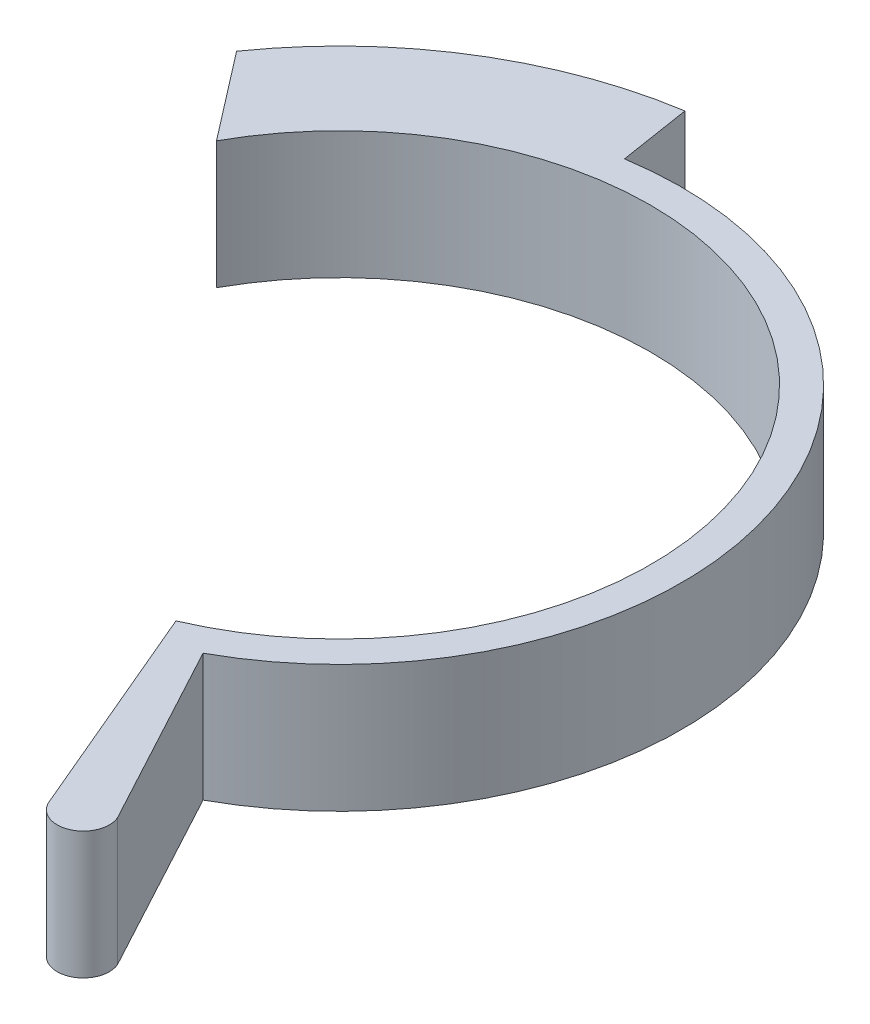
ISO-10303-21;
HEADER;
FILE_DESCRIPTION(('STEP AP214'),'2;1');
FILE_NAME('part.step','',(''),(''),'','','');
FILE_SCHEMA(('AUTOMOTIVE_DESIGN { 1 0 10303 214 1 1 1 1 }'));
ENDSEC;
DATA;
#1=APPLICATION_CONTEXT('core data for automotive mechanical design processes');
#2=APPLICATION_PROTOCOL_DEFINITION('international standard','automotive_design',2000,#1);
#3=PRODUCT_CONTEXT('',#1,'mechanical');
#4=PRODUCT('Part','Part','',(#3));
#5=PRODUCT_RELATED_PRODUCT_CATEGORY('part','',(#4));
#6=PRODUCT_DEFINITION_FORMATION('','',#4);
#7=PRODUCT_DEFINITION_CONTEXT('part definition',#1,'design');
#8=PRODUCT_DEFINITION('design','',#6,#7);
#9=PRODUCT_DEFINITION_SHAPE('','',#8);
#10=(LENGTH_UNIT() NAMED_UNIT(*) SI_UNIT(.MILLI.,.METRE.));
#11=(NAMED_UNIT(*) PLANE_ANGLE_UNIT() SI_UNIT($,.RADIAN.));
#12=(NAMED_UNIT(*) SI_UNIT($,.STERADIAN.) SOLID_ANGLE_UNIT());
#13=UNCERTAINTY_MEASURE_WITH_UNIT(LENGTH_MEASURE(1.E-05),#10,'distance_accuracy_value','');
#14=(GEOMETRIC_REPRESENTATION_CONTEXT(3) GLOBAL_UNCERTAINTY_ASSIGNED_CONTEXT((#13)) GLOBAL_UNIT_ASSIGNED_CONTEXT((#10,
#11,#12)) REPRESENTATION_CONTEXT('',''));
#15=CARTESIAN_POINT('',(0.,0.,0.));
#16=DIRECTION('',(0.,0.,1.));
#17=DIRECTION('',(1.,0.,0.));
#18=AXIS2_PLACEMENT_3D('',#15,#16,#17);
#19=CARTESIAN_POINT('',(0.121103357338385,12.26,-0.0513055872205986));
#20=DIRECTION('',(0.920777378559709,0.,-0.39008847603167));
#21=DIRECTION('',(-0.39008847603167,0.,-0.920777378559709));
#22=AXIS2_PLACEMENT_3D('',#19,#20,#21);
#23=PLANE('',#22);
#24=DIRECTION('',(0.39008847603167,0.,0.920777378559709));
#25=VECTOR('',#24,1.);
#26=CARTESIAN_POINT('',(0.121103357338385,0.,-0.0513055872205986));
#27=LINE('',#26,#25);
#28=CARTESIAN_POINT('',(11.8236451733782,0.,27.5717503037811));
#29=VERTEX_POINT('',#28);
#30=CARTESIAN_POINT('',(20.7956903462746,0.,48.7496541441093));
#31=VERTEX_POINT('',#30);
#32=EDGE_CURVE('E133',#29,#31,#27,.T.);
#33=ORIENTED_EDGE('',*,*,#32,.T.);
#34=DIRECTION('',(0.,-1.,0.));
#35=VECTOR('',#34,1.);
#36=CARTESIAN_POINT('',(20.7956903462746,12.26,48.7496541441093));
#37=LINE('',#36,#35);
#38=CARTESIAN_POINT('',(20.7956903462746,12.26,48.7496541441093));
#39=VERTEX_POINT('',#38);
#40=EDGE_CURVE('E11',#39,#31,#37,.T.);
#41=ORIENTED_EDGE('',*,*,#40,.F.);
#42=DIRECTION('',(0.39008847603167,0.,0.920777378559709));
#43=VECTOR('',#42,1.);
#44=CARTESIAN_POINT('',(0.121103357338385,12.26,-0.0513055872205986));
#45=LINE('',#44,#43);
#46=CARTESIAN_POINT('',(11.8236451733782,12.26,27.5717503037811));
#47=VERTEX_POINT('',#46);
#48=EDGE_CURVE('E151',#47,#39,#45,.T.);
#49=ORIENTED_EDGE('',*,*,#48,.F.);
#50=DIRECTION('',(0.,-1.,0.));
#51=VECTOR('',#50,1.);
#52=CARTESIAN_POINT('',(11.8236451733782,12.26,27.5717503037811));
#53=LINE('',#52,#51);
#54=EDGE_CURVE('E53',#47,#29,#53,.T.);
#55=ORIENTED_EDGE('',*,*,#54,.T.);
#56=EDGE_LOOP('',(#33,#41,#49,#55));
#57=FACE_BOUND('',#56,.T.);
#58=ADVANCED_FACE('F37',(#57),#23,.F.);
#59=CARTESIAN_POINT('',(23.1246397537649,12.26,47.8018296540694));
#60=DIRECTION('',(0.,-1.,0.));
#61=DIRECTION('',(0.,0.,-1.));
#62=AXIS2_PLACEMENT_3D('',#59,#60,#61);
#63=CYLINDRICAL_SURFACE('',#62,2.51443365523314);
#64=CARTESIAN_POINT('',(23.1246397537649,0.,47.8018296540694));
#65=DIRECTION('',(0.,1.,0.));
#66=DIRECTION('',(0.,0.,1.));
#67=AXIS2_PLACEMENT_3D('',#64,#65,#66);
#68=CIRCLE('',#67,2.51443365523314);
#69=CARTESIAN_POINT('',(25.4535891612553,0.,46.8540051640295));
#70=VERTEX_POINT('',#69);
#71=EDGE_CURVE('E135',#31,#70,#68,.T.);
#72=ORIENTED_EDGE('',*,*,#71,.T.);
#73=DIRECTION('',(0.,-1.,0.));
#74=VECTOR('',#73,1.);
#75=CARTESIAN_POINT('',(25.4535891612553,12.26,46.8540051640295));
#76=LINE('',#75,#74);
#77=CARTESIAN_POINT('',(25.4535891612553,12.26,46.8540051640295));
#78=VERTEX_POINT('',#77);
#79=EDGE_CURVE('E45',#78,#70,#76,.T.);
#80=ORIENTED_EDGE('',*,*,#79,.F.);
#81=CARTESIAN_POINT('',(23.1246397537649,12.26,47.8018296540694));
#82=DIRECTION('',(0.,1.,0.));
#83=DIRECTION('',(0.,0.,1.));
#84=AXIS2_PLACEMENT_3D('',#81,#82,#83);
#85=CIRCLE('',#84,2.51443365523314);
#86=EDGE_CURVE('E91',#39,#78,#85,.T.);
#87=ORIENTED_EDGE('',*,*,#86,.F.);
#88=ORIENTED_EDGE('',*,*,#40,.T.);
#89=EDGE_LOOP('',(#72,#80,#87,#88));
#90=FACE_BOUND('',#89,.T.);
#91=ADVANCED_FACE('F180',(#90),#63,.T.);
#92=CARTESIAN_POINT('',(0.185214082331555,12.26,-0.0996739550564852));
#93=DIRECTION('',(-0.880583613390415,0.,0.473890810027246));
#94=DIRECTION('',(0.473890810027246,0.,0.880583613390416));
#95=AXIS2_PLACEMENT_3D('',#92,#93,#94);
#96=PLANE('',#95);
#97=DIRECTION('',(-0.473890810027246,0.,-0.880583613390416));
#98=VECTOR('',#97,1.);
#99=CARTESIAN_POINT('',(0.185214082331555,0.,-0.0996739550564852));
#100=LINE('',#99,#98);
#101=CARTESIAN_POINT('',(15.8232931656359,0.,28.9589950342608));
#102=VERTEX_POINT('',#101);
#103=EDGE_CURVE('E137',#70,#102,#100,.T.);
#104=ORIENTED_EDGE('',*,*,#103,.T.);
#105=DIRECTION('',(0.,-1.,0.));
#106=VECTOR('',#105,1.);
#107=CARTESIAN_POINT('',(15.8232931656359,12.26,28.9589950342608));
#108=LINE('',#107,#106);
#109=CARTESIAN_POINT('',(15.8232931656359,12.26,28.9589950342608));
#110=VERTEX_POINT('',#109);
#111=EDGE_CURVE('E157',#110,#102,#108,.T.);
#112=ORIENTED_EDGE('',*,*,#111,.F.);
#113=DIRECTION('',(-0.473890810027246,0.,-0.880583613390416));
#114=VECTOR('',#113,1.);
#115=CARTESIAN_POINT('',(0.185214082331555,12.26,-0.0996739550564852));
#116=LINE('',#115,#114);
#117=EDGE_CURVE('E165',#78,#110,#116,.T.);
#118=ORIENTED_EDGE('',*,*,#117,.F.);
#119=ORIENTED_EDGE('',*,*,#79,.T.);
#120=EDGE_LOOP('',(#104,#112,#118,#119));
#121=FACE_BOUND('',#120,.T.);
#122=ADVANCED_FACE('F163',(#121),#96,.F.);
#123=CARTESIAN_POINT('',(0.,12.26,0.));
#124=DIRECTION('',(0.,-1.,0.));
#125=DIRECTION('',(0.,0.,-1.));
#126=AXIS2_PLACEMENT_3D('',#123,#124,#125);
#127=CYLINDRICAL_SURFACE('',#126,33.);
#128=CARTESIAN_POINT('',(0.,0.,0.));
#129=DIRECTION('',(0.,1.,0.));
#130=DIRECTION('',(0.,0.,1.));
#131=AXIS2_PLACEMENT_3D('',#128,#129,#130);
#132=CIRCLE('',#131,33.);
#133=CARTESIAN_POINT('',(-5.12453422436956,0.,-32.5996801975612));
#134=VERTEX_POINT('',#133);
#135=EDGE_CURVE('E139',#102,#134,#132,.T.);
#136=ORIENTED_EDGE('',*,*,#135,.T.);
#137=DIRECTION('',(0.,-1.,0.));
#138=VECTOR('',#137,1.);
#139=CARTESIAN_POINT('',(-5.12453422436956,12.26,-32.5996801975612));
#140=LINE('',#139,#138);
#141=CARTESIAN_POINT('',(-5.12453422436956,12.26,-32.5996801975612));
#142=VERTEX_POINT('',#141);
#143=EDGE_CURVE('E155',#142,#134,#140,.T.);
#144=ORIENTED_EDGE('',*,*,#143,.F.);
#145=CARTESIAN_POINT('',(0.,12.26,0.));
#146=DIRECTION('',(0.,1.,0.));
#147=DIRECTION('',(0.,0.,1.));
#148=AXIS2_PLACEMENT_3D('',#145,#146,#147);
#149=CIRCLE('',#148,33.);
#150=EDGE_CURVE('E174',#110,#142,#149,.T.);
#151=ORIENTED_EDGE('',*,*,#150,.F.);
#152=ORIENTED_EDGE('',*,*,#111,.T.);
#153=EDGE_LOOP('',(#136,#144,#151,#152));
#154=FACE_BOUND('',#153,.T.);
#155=ADVANCED_FACE('F172',(#154),#127,.T.);
#156=CARTESIAN_POINT('',(0.,12.26,0.));
#157=DIRECTION('',(0.987869096895794,0.,-0.155288915889987));
#158=DIRECTION('',(-0.155288915889987,0.,-0.987869096895794));
#159=AXIS2_PLACEMENT_3D('',#156,#157,#158);
#160=PLANE('',#159);
#161=DIRECTION('',(0.155288915889987,0.,0.987869096895794));
#162=VECTOR('',#161,1.);
#163=CARTESIAN_POINT('',(0.,0.,0.));
#164=LINE('',#163,#162);
#165=CARTESIAN_POINT('',(-6.21155663559947,0.,-39.5147638758318));
#166=VERTEX_POINT('',#165);
#167=EDGE_CURVE('E142',#166,#134,#164,.T.);
#168=ORIENTED_EDGE('',*,*,#167,.F.);
#169=DIRECTION('',(0.,-1.,0.));
#170=VECTOR('',#169,1.);
#171=CARTESIAN_POINT('',(-6.21155663559947,12.26,-39.5147638758318));
#172=LINE('',#171,#170);
#173=CARTESIAN_POINT('',(-6.21155663559947,12.26,-39.5147638758318));
#174=VERTEX_POINT('',#173);
#175=EDGE_CURVE('E125',#174,#166,#172,.T.);
#176=ORIENTED_EDGE('',*,*,#175,.F.);
#177=DIRECTION('',(0.155288915889987,0.,0.987869096895794));
#178=VECTOR('',#177,1.);
#179=CARTESIAN_POINT('',(0.,12.26,0.));
#180=LINE('',#179,#178);
#181=EDGE_CURVE('E115',#174,#142,#180,.T.);
#182=ORIENTED_EDGE('',*,*,#181,.T.);
#183=ORIENTED_EDGE('',*,*,#143,.T.);
#184=EDGE_LOOP('',(#168,#176,#182,#183));
#185=FACE_BOUND('',#184,.T.);
#186=ADVANCED_FACE('F190',(#185),#160,.T.);
#187=CARTESIAN_POINT('',(0.,12.26,0.));
#188=DIRECTION('',(0.,-1.,0.));
#189=DIRECTION('',(0.,0.,-1.));
#190=AXIS2_PLACEMENT_3D('',#187,#188,#189);
#191=CYLINDRICAL_SURFACE('',#190,40.);
#192=CARTESIAN_POINT('',(0.,0.,0.));
#193=DIRECTION('',(0.,1.,0.));
#194=DIRECTION('',(0.,0.,1.));
#195=AXIS2_PLACEMENT_3D('',#192,#193,#194);
#196=CIRCLE('',#195,40.);
#197=CARTESIAN_POINT('',(-32.8000736984818,0.,-22.8944352490766));
#198=VERTEX_POINT('',#197);
#199=EDGE_CURVE('E122',#166,#198,#196,.T.);
#200=ORIENTED_EDGE('',*,*,#199,.T.);
#201=DIRECTION('',(0.,-1.,0.));
#202=VECTOR('',#201,1.);
#203=CARTESIAN_POINT('',(-32.8000736984818,12.26,-22.8944352490766));
#204=LINE('',#203,#202);
#205=CARTESIAN_POINT('',(-32.8000736984818,12.26,-22.8944352490766));
#206=VERTEX_POINT('',#205);
#207=EDGE_CURVE('E119',#206,#198,#204,.T.);
#208=ORIENTED_EDGE('',*,*,#207,.F.);
#209=CARTESIAN_POINT('',(0.,12.26,0.));
#210=DIRECTION('',(0.,1.,0.));
#211=DIRECTION('',(0.,0.,1.));
#212=AXIS2_PLACEMENT_3D('',#209,#210,#211);
#213=CIRCLE('',#212,40.);
#214=EDGE_CURVE('E108',#174,#206,#213,.T.);
#215=ORIENTED_EDGE('',*,*,#214,.F.);
#216=ORIENTED_EDGE('',*,*,#175,.T.);
#217=EDGE_LOOP('',(#200,#208,#215,#216));
#218=FACE_BOUND('',#217,.T.);
#219=ADVANCED_FACE('F120',(#218),#191,.T.);
#220=CARTESIAN_POINT('',(-9.50397641638218,12.26,7.3262836606871));
#221=DIRECTION('',(-0.791998034698516,0.,0.610523638390593));
#222=DIRECTION('',(0.610523638390593,0.,0.791998034698516));
#223=AXIS2_PLACEMENT_3D('',#220,#221,#222);
#224=PLANE('',#223);
#225=DIRECTION('',(-0.610523638390593,0.,-0.791998034698517));
#226=VECTOR('',#225,1.);
#227=CARTESIAN_POINT('',(-9.50397641638218,0.,7.3262836606871));
#228=LINE('',#227,#226);
#229=CARTESIAN_POINT('',(-26.2906011352906,0.,-14.4500620048862));
#230=VERTEX_POINT('',#229);
#231=EDGE_CURVE('E146',#230,#198,#228,.T.);
#232=ORIENTED_EDGE('',*,*,#231,.F.);
#233=DIRECTION('',(0.,-1.,0.));
#234=VECTOR('',#233,1.);
#235=CARTESIAN_POINT('',(-26.2906011352906,12.26,-14.4500620048862));
#236=LINE('',#235,#234);
#237=CARTESIAN_POINT('',(-26.2906011352906,12.26,-14.4500620048862));
#238=VERTEX_POINT('',#237);
#239=EDGE_CURVE('E79',#238,#230,#236,.T.);
#240=ORIENTED_EDGE('',*,*,#239,.F.);
#241=DIRECTION('',(-0.610523638390593,0.,-0.791998034698517));
#242=VECTOR('',#241,1.);
#243=CARTESIAN_POINT('',(-9.50397641638218,12.26,7.3262836606871));
#244=LINE('',#243,#242);
#245=EDGE_CURVE('E113',#238,#206,#244,.T.);
#246=ORIENTED_EDGE('',*,*,#245,.T.);
#247=ORIENTED_EDGE('',*,*,#207,.T.);
#248=EDGE_LOOP('',(#232,#240,#246,#247));
#249=FACE_BOUND('',#248,.T.);
#250=ADVANCED_FACE('F127',(#249),#224,.T.);
#251=CARTESIAN_POINT('',(0.,12.26,0.));
#252=DIRECTION('',(0.,-1.,0.));
#253=DIRECTION('',(0.,0.,-1.));
#254=AXIS2_PLACEMENT_3D('',#251,#252,#253);
#255=CYLINDRICAL_SURFACE('',#254,30.);
#256=CARTESIAN_POINT('',(0.,0.,0.));
#257=DIRECTION('',(0.,1.,0.));
#258=DIRECTION('',(0.,0.,1.));
#259=AXIS2_PLACEMENT_3D('',#256,#257,#258);
#260=CIRCLE('',#259,30.);
#261=EDGE_CURVE('E148',#29,#230,#260,.T.);
#262=ORIENTED_EDGE('',*,*,#261,.F.);
#263=ORIENTED_EDGE('',*,*,#54,.F.);
#264=CARTESIAN_POINT('',(0.,12.26,0.));
#265=DIRECTION('',(0.,1.,0.));
#266=DIRECTION('',(0.,0.,1.));
#267=AXIS2_PLACEMENT_3D('',#264,#265,#266);
#268=CIRCLE('',#267,30.);
#269=EDGE_CURVE('E128',#47,#238,#268,.T.);
#270=ORIENTED_EDGE('',*,*,#269,.T.);
#271=ORIENTED_EDGE('',*,*,#239,.T.);
#272=EDGE_LOOP('',(#262,#263,#270,#271));
#273=FACE_BOUND('',#272,.T.);
#274=ADVANCED_FACE('F198',(#273),#255,.F.);
#275=CARTESIAN_POINT('',(0.,12.26,0.));
#276=DIRECTION('',(0.,1.,0.));
#277=DIRECTION('',(0.,0.,1.));
#278=AXIS2_PLACEMENT_3D('',#275,#276,#277);
#279=PLANE('',#278);
#280=ORIENTED_EDGE('',*,*,#48,.T.);
#281=ORIENTED_EDGE('',*,*,#86,.T.);
#282=ORIENTED_EDGE('',*,*,#117,.T.);
#283=ORIENTED_EDGE('',*,*,#150,.T.);
#284=ORIENTED_EDGE('',*,*,#181,.F.);
#285=ORIENTED_EDGE('',*,*,#214,.T.);
#286=ORIENTED_EDGE('',*,*,#245,.F.);
#287=ORIENTED_EDGE('',*,*,#269,.F.);
#288=EDGE_LOOP('',(#280,#281,#282,#283,#284,#285,#286,#287));
#289=FACE_BOUND('',#288,.T.);
#290=ADVANCED_FACE('F110',(#289),#279,.T.);
#291=CARTESIAN_POINT('',(0.,0.,0.));
#292=DIRECTION('',(0.,1.,0.));
#293=DIRECTION('',(0.,0.,1.));
#294=AXIS2_PLACEMENT_3D('',#291,#292,#293);
#295=PLANE('',#294);
#296=ORIENTED_EDGE('',*,*,#32,.F.);
#297=ORIENTED_EDGE('',*,*,#261,.T.);
#298=ORIENTED_EDGE('',*,*,#231,.T.);
#299=ORIENTED_EDGE('',*,*,#199,.F.);
#300=ORIENTED_EDGE('',*,*,#167,.T.);
#301=ORIENTED_EDGE('',*,*,#135,.F.);
#302=ORIENTED_EDGE('',*,*,#103,.F.);
#303=ORIENTED_EDGE('',*,*,#71,.F.);
#304=EDGE_LOOP('',(#296,#297,#298,#299,#300,#301,#302,#303));
#305=FACE_BOUND('',#304,.T.);
#306=ADVANCED_FACE('F168',(#305),#295,.F.);
#307=CLOSED_SHELL('',(#58,#91,#122,#155,#186,#219,#250,#274,#290,#306));
#308=MANIFOLD_SOLID_BREP('B2',#307);
#309=ADVANCED_BREP_SHAPE_REPRESENTATION('',(#18,#308),#14);
#310=SHAPE_DEFINITION_REPRESENTATION(#9,#309);
ENDSEC;
END-ISO-10303-21;
